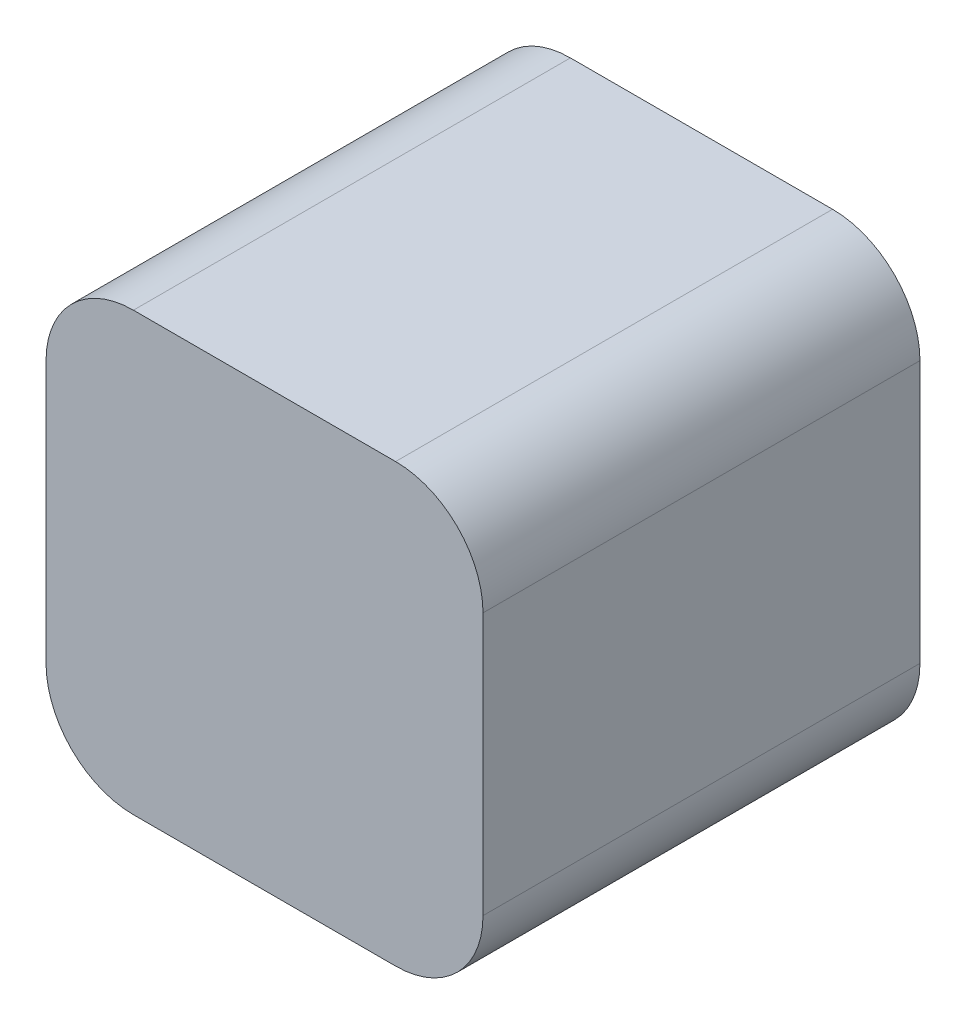
ISO-10303-21;
HEADER;
FILE_DESCRIPTION(('STEP AP214'),'2;1');
FILE_NAME('part.step','',(''),(''),'','','');
FILE_SCHEMA(('AUTOMOTIVE_DESIGN { 1 0 10303 214 1 1 1 1 }'));
ENDSEC;
DATA;
#1=APPLICATION_CONTEXT('core data for automotive mechanical design processes');
#2=APPLICATION_PROTOCOL_DEFINITION('international standard','automotive_design',2000,#1);
#3=PRODUCT_CONTEXT('',#1,'mechanical');
#4=PRODUCT('Part','Part','',(#3));
#5=PRODUCT_RELATED_PRODUCT_CATEGORY('part','',(#4));
#6=PRODUCT_DEFINITION_FORMATION('','',#4);
#7=PRODUCT_DEFINITION_CONTEXT('part definition',#1,'design');
#8=PRODUCT_DEFINITION('design','',#6,#7);
#9=PRODUCT_DEFINITION_SHAPE('','',#8);
#10=(LENGTH_UNIT() NAMED_UNIT(*) SI_UNIT(.MILLI.,.METRE.));
#11=(NAMED_UNIT(*) PLANE_ANGLE_UNIT() SI_UNIT($,.RADIAN.));
#12=(NAMED_UNIT(*) SI_UNIT($,.STERADIAN.) SOLID_ANGLE_UNIT());
#13=UNCERTAINTY_MEASURE_WITH_UNIT(LENGTH_MEASURE(1.E-05),#10,'distance_accuracy_value','');
#14=(GEOMETRIC_REPRESENTATION_CONTEXT(3) GLOBAL_UNCERTAINTY_ASSIGNED_CONTEXT((#13)) GLOBAL_UNIT_ASSIGNED_CONTEXT((#10,
#11,#12)) REPRESENTATION_CONTEXT('',''));
#15=CARTESIAN_POINT('',(0.,0.,0.));
#16=DIRECTION('',(0.,0.,1.));
#17=DIRECTION('',(1.,0.,0.));
#18=AXIS2_PLACEMENT_3D('',#15,#16,#17);
#19=CARTESIAN_POINT('',(7.5,7.5,15.));
#20=DIRECTION('',(-1.,0.,0.));
#21=DIRECTION('',(0.,-1.,0.));
#22=AXIS2_PLACEMENT_3D('',#19,#20,#21);
#23=PLANE('',#22);
#24=DIRECTION('',(0.,1.,0.));
#25=VECTOR('',#24,1.);
#26=CARTESIAN_POINT('',(7.5,7.5,0.));
#27=LINE('',#26,#25);
#28=CARTESIAN_POINT('',(7.5,-4.5,0.));
#29=VERTEX_POINT('',#28);
#30=CARTESIAN_POINT('',(7.5,4.5,0.));
#31=VERTEX_POINT('',#30);
#32=EDGE_CURVE('E128',#29,#31,#27,.T.);
#33=ORIENTED_EDGE('',*,*,#32,.T.);
#34=DIRECTION('',(0.,0.,-1.));
#35=VECTOR('',#34,1.);
#36=CARTESIAN_POINT('',(7.5,4.5,15.));
#37=LINE('',#36,#35);
#38=CARTESIAN_POINT('',(7.5,4.5,15.));
#39=VERTEX_POINT('',#38);
#40=EDGE_CURVE('E105',#31,#39,#37,.F.);
#41=ORIENTED_EDGE('',*,*,#40,.T.);
#42=DIRECTION('',(0.,1.,0.));
#43=VECTOR('',#42,1.);
#44=CARTESIAN_POINT('',(7.5,7.5,15.));
#45=LINE('',#44,#43);
#46=CARTESIAN_POINT('',(7.5,-4.5,15.));
#47=VERTEX_POINT('',#46);
#48=EDGE_CURVE('E137',#47,#39,#45,.T.);
#49=ORIENTED_EDGE('',*,*,#48,.F.);
#50=DIRECTION('',(0.,0.,-1.));
#51=VECTOR('',#50,1.);
#52=CARTESIAN_POINT('',(7.5,-4.5,15.));
#53=LINE('',#52,#51);
#54=EDGE_CURVE('E110',#47,#29,#53,.T.);
#55=ORIENTED_EDGE('',*,*,#54,.T.);
#56=EDGE_LOOP('',(#33,#41,#49,#55));
#57=FACE_BOUND('',#56,.T.);
#58=ADVANCED_FACE('F33',(#57),#23,.F.);
#59=CARTESIAN_POINT('',(-7.5,7.5,15.));
#60=DIRECTION('',(0.,-1.,0.));
#61=DIRECTION('',(0.,0.,-1.));
#62=AXIS2_PLACEMENT_3D('',#59,#60,#61);
#63=PLANE('',#62);
#64=DIRECTION('',(-1.,0.,0.));
#65=VECTOR('',#64,1.);
#66=CARTESIAN_POINT('',(-7.5,7.5,15.));
#67=LINE('',#66,#65);
#68=CARTESIAN_POINT('',(4.5,7.5,15.));
#69=VERTEX_POINT('',#68);
#70=CARTESIAN_POINT('',(-4.5,7.5,15.));
#71=VERTEX_POINT('',#70);
#72=EDGE_CURVE('E120',#69,#71,#67,.T.);
#73=ORIENTED_EDGE('',*,*,#72,.F.);
#74=DIRECTION('',(0.,0.,-1.));
#75=VECTOR('',#74,1.);
#76=CARTESIAN_POINT('',(4.5,7.5,15.));
#77=LINE('',#76,#75);
#78=CARTESIAN_POINT('',(4.5,7.5,0.));
#79=VERTEX_POINT('',#78);
#80=EDGE_CURVE('E104',#69,#79,#77,.T.);
#81=ORIENTED_EDGE('',*,*,#80,.T.);
#82=DIRECTION('',(-1.,0.,0.));
#83=VECTOR('',#82,1.);
#84=CARTESIAN_POINT('',(-7.5,7.5,0.));
#85=LINE('',#84,#83);
#86=CARTESIAN_POINT('',(-4.5,7.5,0.));
#87=VERTEX_POINT('',#86);
#88=EDGE_CURVE('E117',#79,#87,#85,.T.);
#89=ORIENTED_EDGE('',*,*,#88,.T.);
#90=DIRECTION('',(0.,0.,-1.));
#91=VECTOR('',#90,1.);
#92=CARTESIAN_POINT('',(-4.5,7.5,15.));
#93=LINE('',#92,#91);
#94=EDGE_CURVE('E122',#87,#71,#93,.F.);
#95=ORIENTED_EDGE('',*,*,#94,.T.);
#96=EDGE_LOOP('',(#73,#81,#89,#95));
#97=FACE_BOUND('',#96,.T.);
#98=ADVANCED_FACE('F116',(#97),#63,.F.);
#99=CARTESIAN_POINT('',(-7.5,7.5,15.));
#100=DIRECTION('',(1.,0.,0.));
#101=DIRECTION('',(0.,1.,0.));
#102=AXIS2_PLACEMENT_3D('',#99,#100,#101);
#103=PLANE('',#102);
#104=DIRECTION('',(0.,-1.,0.));
#105=VECTOR('',#104,1.);
#106=CARTESIAN_POINT('',(-7.5,7.5,15.));
#107=LINE('',#106,#105);
#108=CARTESIAN_POINT('',(-7.5,4.5,15.));
#109=VERTEX_POINT('',#108);
#110=CARTESIAN_POINT('',(-7.5,-4.5,15.));
#111=VERTEX_POINT('',#110);
#112=EDGE_CURVE('E160',#109,#111,#107,.T.);
#113=ORIENTED_EDGE('',*,*,#112,.F.);
#114=DIRECTION('',(0.,0.,-1.));
#115=VECTOR('',#114,1.);
#116=CARTESIAN_POINT('',(-7.5,4.5,15.));
#117=LINE('',#116,#115);
#118=CARTESIAN_POINT('',(-7.5,4.5,0.));
#119=VERTEX_POINT('',#118);
#120=EDGE_CURVE('E11',#109,#119,#117,.T.);
#121=ORIENTED_EDGE('',*,*,#120,.T.);
#122=DIRECTION('',(0.,-1.,0.));
#123=VECTOR('',#122,1.);
#124=CARTESIAN_POINT('',(-7.5,7.5,0.));
#125=LINE('',#124,#123);
#126=CARTESIAN_POINT('',(-7.5,-4.5,0.));
#127=VERTEX_POINT('',#126);
#128=EDGE_CURVE('E127',#119,#127,#125,.T.);
#129=ORIENTED_EDGE('',*,*,#128,.T.);
#130=DIRECTION('',(0.,0.,-1.));
#131=VECTOR('',#130,1.);
#132=CARTESIAN_POINT('',(-7.5,-4.5,15.));
#133=LINE('',#132,#131);
#134=EDGE_CURVE('E41',#127,#111,#133,.F.);
#135=ORIENTED_EDGE('',*,*,#134,.T.);
#136=EDGE_LOOP('',(#113,#121,#129,#135));
#137=FACE_BOUND('',#136,.T.);
#138=ADVANCED_FACE('F159',(#137),#103,.F.);
#139=CARTESIAN_POINT('',(-7.5,-7.5,15.));
#140=DIRECTION('',(0.,1.,0.));
#141=DIRECTION('',(0.,0.,1.));
#142=AXIS2_PLACEMENT_3D('',#139,#140,#141);
#143=PLANE('',#142);
#144=DIRECTION('',(1.,0.,0.));
#145=VECTOR('',#144,1.);
#146=CARTESIAN_POINT('',(-7.5,-7.5,0.));
#147=LINE('',#146,#145);
#148=CARTESIAN_POINT('',(-4.5,-7.5,0.));
#149=VERTEX_POINT('',#148);
#150=CARTESIAN_POINT('',(4.5,-7.5,0.));
#151=VERTEX_POINT('',#150);
#152=EDGE_CURVE('E131',#149,#151,#147,.T.);
#153=ORIENTED_EDGE('',*,*,#152,.T.);
#154=DIRECTION('',(0.,0.,-1.));
#155=VECTOR('',#154,1.);
#156=CARTESIAN_POINT('',(4.5,-7.5,15.));
#157=LINE('',#156,#155);
#158=CARTESIAN_POINT('',(4.5,-7.5,15.));
#159=VERTEX_POINT('',#158);
#160=EDGE_CURVE('E48',#151,#159,#157,.F.);
#161=ORIENTED_EDGE('',*,*,#160,.T.);
#162=DIRECTION('',(1.,0.,0.));
#163=VECTOR('',#162,1.);
#164=CARTESIAN_POINT('',(-7.5,-7.5,15.));
#165=LINE('',#164,#163);
#166=CARTESIAN_POINT('',(-4.5,-7.5,15.));
#167=VERTEX_POINT('',#166);
#168=EDGE_CURVE('E138',#167,#159,#165,.T.);
#169=ORIENTED_EDGE('',*,*,#168,.F.);
#170=DIRECTION('',(0.,0.,-1.));
#171=VECTOR('',#170,1.);
#172=CARTESIAN_POINT('',(-4.5,-7.5,15.));
#173=LINE('',#172,#171);
#174=EDGE_CURVE('E153',#167,#149,#173,.T.);
#175=ORIENTED_EDGE('',*,*,#174,.T.);
#176=EDGE_LOOP('',(#153,#161,#169,#175));
#177=FACE_BOUND('',#176,.T.);
#178=ADVANCED_FACE('F169',(#177),#143,.F.);
#179=CARTESIAN_POINT('',(0.,0.,15.));
#180=DIRECTION('',(0.,0.,1.));
#181=DIRECTION('',(1.,0.,0.));
#182=AXIS2_PLACEMENT_3D('',#179,#180,#181);
#183=PLANE('',#182);
#184=ORIENTED_EDGE('',*,*,#48,.T.);
#185=CARTESIAN_POINT('',(4.5,4.5,15.));
#186=DIRECTION('',(0.,0.,1.));
#187=DIRECTION('',(1.,0.,0.));
#188=AXIS2_PLACEMENT_3D('',#185,#186,#187);
#189=CIRCLE('',#188,3.);
#190=EDGE_CURVE('E151',#39,#69,#189,.T.);
#191=ORIENTED_EDGE('',*,*,#190,.T.);
#192=ORIENTED_EDGE('',*,*,#72,.T.);
#193=CARTESIAN_POINT('',(-4.5,4.5,15.));
#194=DIRECTION('',(0.,0.,1.));
#195=DIRECTION('',(1.,0.,0.));
#196=AXIS2_PLACEMENT_3D('',#193,#194,#195);
#197=CIRCLE('',#196,3.);
#198=EDGE_CURVE('E147',#71,#109,#197,.T.);
#199=ORIENTED_EDGE('',*,*,#198,.T.);
#200=ORIENTED_EDGE('',*,*,#112,.T.);
#201=CARTESIAN_POINT('',(-4.5,-4.5,15.));
#202=DIRECTION('',(0.,0.,1.));
#203=DIRECTION('',(1.,0.,0.));
#204=AXIS2_PLACEMENT_3D('',#201,#202,#203);
#205=CIRCLE('',#204,3.);
#206=EDGE_CURVE('E55',#111,#167,#205,.T.);
#207=ORIENTED_EDGE('',*,*,#206,.T.);
#208=ORIENTED_EDGE('',*,*,#168,.T.);
#209=CARTESIAN_POINT('',(4.5,-4.5,15.));
#210=DIRECTION('',(0.,0.,1.));
#211=DIRECTION('',(1.,0.,0.));
#212=AXIS2_PLACEMENT_3D('',#209,#210,#211);
#213=CIRCLE('',#212,3.);
#214=EDGE_CURVE('E149',#159,#47,#213,.T.);
#215=ORIENTED_EDGE('',*,*,#214,.T.);
#216=EDGE_LOOP('',(#184,#191,#192,#199,#200,#207,#208,#215));
#217=FACE_BOUND('',#216,.T.);
#218=ADVANCED_FACE('F164',(#217),#183,.T.);
#219=CARTESIAN_POINT('',(0.,0.,0.));
#220=DIRECTION('',(0.,0.,1.));
#221=DIRECTION('',(1.,0.,0.));
#222=AXIS2_PLACEMENT_3D('',#219,#220,#221);
#223=PLANE('',#222);
#224=ORIENTED_EDGE('',*,*,#88,.F.);
#225=CARTESIAN_POINT('',(4.5,4.5,0.));
#226=DIRECTION('',(0.,0.,1.));
#227=DIRECTION('',(1.,0.,0.));
#228=AXIS2_PLACEMENT_3D('',#225,#226,#227);
#229=CIRCLE('',#228,3.);
#230=EDGE_CURVE('E100',#79,#31,#229,.F.);
#231=ORIENTED_EDGE('',*,*,#230,.T.);
#232=ORIENTED_EDGE('',*,*,#32,.F.);
#233=CARTESIAN_POINT('',(4.5,-4.5,0.));
#234=DIRECTION('',(0.,0.,1.));
#235=DIRECTION('',(1.,0.,0.));
#236=AXIS2_PLACEMENT_3D('',#233,#234,#235);
#237=CIRCLE('',#236,3.);
#238=EDGE_CURVE('E111',#29,#151,#237,.F.);
#239=ORIENTED_EDGE('',*,*,#238,.T.);
#240=ORIENTED_EDGE('',*,*,#152,.F.);
#241=CARTESIAN_POINT('',(-4.5,-4.5,0.));
#242=DIRECTION('',(0.,0.,1.));
#243=DIRECTION('',(1.,0.,0.));
#244=AXIS2_PLACEMENT_3D('',#241,#242,#243);
#245=CIRCLE('',#244,3.);
#246=EDGE_CURVE('E121',#149,#127,#245,.F.);
#247=ORIENTED_EDGE('',*,*,#246,.T.);
#248=ORIENTED_EDGE('',*,*,#128,.F.);
#249=CARTESIAN_POINT('',(-4.5,4.5,0.));
#250=DIRECTION('',(0.,0.,1.));
#251=DIRECTION('',(1.,0.,0.));
#252=AXIS2_PLACEMENT_3D('',#249,#250,#251);
#253=CIRCLE('',#252,3.);
#254=EDGE_CURVE('E126',#119,#87,#253,.F.);
#255=ORIENTED_EDGE('',*,*,#254,.T.);
#256=EDGE_LOOP('',(#224,#231,#232,#239,#240,#247,#248,#255));
#257=FACE_BOUND('',#256,.T.);
#258=ADVANCED_FACE('F124',(#257),#223,.F.);
#259=CARTESIAN_POINT('',(4.5,4.5,15.));
#260=DIRECTION('',(0.,0.,-1.));
#261=DIRECTION('',(-1.,0.,0.));
#262=AXIS2_PLACEMENT_3D('',#259,#260,#261);
#263=CYLINDRICAL_SURFACE('',#262,3.);
#264=ORIENTED_EDGE('',*,*,#190,.F.);
#265=ORIENTED_EDGE('',*,*,#40,.F.);
#266=ORIENTED_EDGE('',*,*,#230,.F.);
#267=ORIENTED_EDGE('',*,*,#80,.F.);
#268=EDGE_LOOP('',(#264,#265,#266,#267));
#269=FACE_BOUND('',#268,.T.);
#270=ADVANCED_FACE('F103',(#269),#263,.T.);
#271=CARTESIAN_POINT('',(4.5,-4.5,15.));
#272=DIRECTION('',(0.,0.,-1.));
#273=DIRECTION('',(-1.,0.,0.));
#274=AXIS2_PLACEMENT_3D('',#271,#272,#273);
#275=CYLINDRICAL_SURFACE('',#274,3.);
#276=ORIENTED_EDGE('',*,*,#214,.F.);
#277=ORIENTED_EDGE('',*,*,#160,.F.);
#278=ORIENTED_EDGE('',*,*,#238,.F.);
#279=ORIENTED_EDGE('',*,*,#54,.F.);
#280=EDGE_LOOP('',(#276,#277,#278,#279));
#281=FACE_BOUND('',#280,.T.);
#282=ADVANCED_FACE('F173',(#281),#275,.T.);
#283=CARTESIAN_POINT('',(-4.5,4.5,15.));
#284=DIRECTION('',(0.,0.,-1.));
#285=DIRECTION('',(-1.,0.,0.));
#286=AXIS2_PLACEMENT_3D('',#283,#284,#285);
#287=CYLINDRICAL_SURFACE('',#286,3.);
#288=ORIENTED_EDGE('',*,*,#198,.F.);
#289=ORIENTED_EDGE('',*,*,#94,.F.);
#290=ORIENTED_EDGE('',*,*,#254,.F.);
#291=ORIENTED_EDGE('',*,*,#120,.F.);
#292=EDGE_LOOP('',(#288,#289,#290,#291));
#293=FACE_BOUND('',#292,.T.);
#294=ADVANCED_FACE('F179',(#293),#287,.T.);
#295=CARTESIAN_POINT('',(-4.5,-4.5,15.));
#296=DIRECTION('',(0.,0.,-1.));
#297=DIRECTION('',(-1.,0.,0.));
#298=AXIS2_PLACEMENT_3D('',#295,#296,#297);
#299=CYLINDRICAL_SURFACE('',#298,3.);
#300=ORIENTED_EDGE('',*,*,#206,.F.);
#301=ORIENTED_EDGE('',*,*,#134,.F.);
#302=ORIENTED_EDGE('',*,*,#246,.F.);
#303=ORIENTED_EDGE('',*,*,#174,.F.);
#304=EDGE_LOOP('',(#300,#301,#302,#303));
#305=FACE_BOUND('',#304,.T.);
#306=ADVANCED_FACE('F35',(#305),#299,.T.);
#307=CLOSED_SHELL('',(#58,#98,#138,#178,#218,#258,#270,#282,#294,#306));
#308=MANIFOLD_SOLID_BREP('B2',#307);
#309=ADVANCED_BREP_SHAPE_REPRESENTATION('',(#18,#308),#14);
#310=SHAPE_DEFINITION_REPRESENTATION(#9,#309);
ENDSEC;
END-ISO-10303-21;
